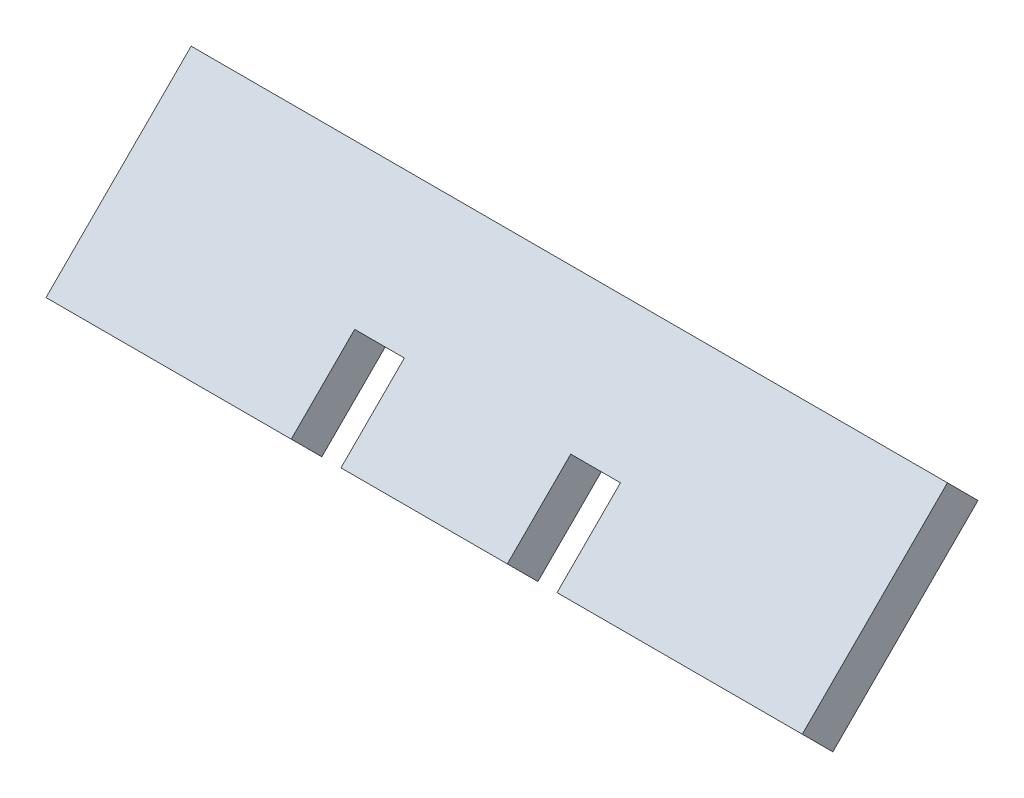
ISO-10303-21;
HEADER;
FILE_DESCRIPTION(('STEP AP214'),'2;1');
FILE_NAME('part.step','',(''),(''),'','','');
FILE_SCHEMA(('AUTOMOTIVE_DESIGN { 1 0 10303 214 1 1 1 1 }'));
ENDSEC;
DATA;
#1=APPLICATION_CONTEXT('core data for automotive mechanical design processes');
#2=APPLICATION_PROTOCOL_DEFINITION('international standard','automotive_design',2000,#1);
#3=PRODUCT_CONTEXT('',#1,'mechanical');
#4=PRODUCT('Part','Part','',(#3));
#5=PRODUCT_RELATED_PRODUCT_CATEGORY('part','',(#4));
#6=PRODUCT_DEFINITION_FORMATION('','',#4);
#7=PRODUCT_DEFINITION_CONTEXT('part definition',#1,'design');
#8=PRODUCT_DEFINITION('design','',#6,#7);
#9=PRODUCT_DEFINITION_SHAPE('','',#8);
#10=(LENGTH_UNIT() NAMED_UNIT(*) SI_UNIT(.MILLI.,.METRE.));
#11=(NAMED_UNIT(*) PLANE_ANGLE_UNIT() SI_UNIT($,.RADIAN.));
#12=(NAMED_UNIT(*) SI_UNIT($,.STERADIAN.) SOLID_ANGLE_UNIT());
#13=UNCERTAINTY_MEASURE_WITH_UNIT(LENGTH_MEASURE(1.E-05),#10,'distance_accuracy_value','');
#14=(GEOMETRIC_REPRESENTATION_CONTEXT(3) GLOBAL_UNCERTAINTY_ASSIGNED_CONTEXT((#13)) GLOBAL_UNIT_ASSIGNED_CONTEXT((#10,
#11,#12)) REPRESENTATION_CONTEXT('',''));
#15=CARTESIAN_POINT('',(0.,0.,0.));
#16=DIRECTION('',(0.,0.,1.));
#17=DIRECTION('',(1.,0.,0.));
#18=AXIS2_PLACEMENT_3D('',#15,#16,#17);
#19=CARTESIAN_POINT('',(-349.7,88.3951018154562,54.8947169102428));
#20=DIRECTION('',(0.,-0.707106781186548,-0.707106781186547));
#21=DIRECTION('',(0.,0.707106781186547,-0.707106781186548));
#22=AXIS2_PLACEMENT_3D('',#19,#20,#21);
#23=PLANE('',#22);
#24=DIRECTION('',(1.,0.,0.));
#25=VECTOR('',#24,1.);
#26=CARTESIAN_POINT('',(-349.7,88.3951018154562,54.8947169102428));
#27=LINE('',#26,#25);
#28=CARTESIAN_POINT('',(-329.7,88.3951018154562,54.8947169102428));
#29=VERTEX_POINT('',#28);
#30=CARTESIAN_POINT('',(-259.7,88.3951018154562,54.8947169102428));
#31=VERTEX_POINT('',#30);
#32=EDGE_CURVE('E165',#29,#31,#27,.T.);
#33=ORIENTED_EDGE('',*,*,#32,.T.);
#34=DIRECTION('',(0.,-0.707106781186547,0.707106781186548));
#35=VECTOR('',#34,1.);
#36=CARTESIAN_POINT('',(-259.7,88.3951018154562,54.8947169102428));
#37=LINE('',#36,#35);
#38=CARTESIAN_POINT('',(-259.7,74.9600729729119,68.3297457527872));
#39=VERTEX_POINT('',#38);
#40=EDGE_CURVE('E61',#31,#39,#37,.T.);
#41=ORIENTED_EDGE('',*,*,#40,.T.);
#42=DIRECTION('',(1.,0.,0.));
#43=VECTOR('',#42,1.);
#44=CARTESIAN_POINT('',(-349.7,74.9600729729119,68.3297457527872));
#45=LINE('',#44,#43);
#46=CARTESIAN_POINT('',(-282.4,74.9600729729119,68.3297457527872));
#47=VERTEX_POINT('',#46);
#48=EDGE_CURVE('E222',#47,#39,#45,.T.);
#49=ORIENTED_EDGE('',*,*,#48,.F.);
#50=DIRECTION('',(0.,0.707106781186546,-0.707106781186549));
#51=VECTOR('',#50,1.);
#52=CARTESIAN_POINT('',(-282.4,66.0267655037632,77.2630532219361));
#53=LINE('',#52,#51);
#54=CARTESIAN_POINT('',(-282.4,80.8290592567604,62.4607594689388));
#55=VERTEX_POINT('',#54);
#56=EDGE_CURVE('E174',#47,#55,#53,.T.);
#57=ORIENTED_EDGE('',*,*,#56,.T.);
#58=DIRECTION('',(1.,0.,0.));
#59=VECTOR('',#58,1.);
#60=CARTESIAN_POINT('',(-282.55,80.8290592567604,62.4607594689388));
#61=LINE('',#60,#59);
#62=CARTESIAN_POINT('',(-287.,80.8290592567604,62.4607594689388));
#63=VERTEX_POINT('',#62);
#64=EDGE_CURVE('E180',#55,#63,#61,.F.);
#65=ORIENTED_EDGE('',*,*,#64,.T.);
#66=DIRECTION('',(0.,0.707106781186546,-0.707106781186549));
#67=VECTOR('',#66,1.);
#68=CARTESIAN_POINT('',(-287.,80.7229932395824,62.5668254861168));
#69=LINE('',#68,#67);
#70=CARTESIAN_POINT('',(-287.,74.9600729729119,68.3297457527873));
#71=VERTEX_POINT('',#70);
#72=EDGE_CURVE('E175',#63,#71,#69,.F.);
#73=ORIENTED_EDGE('',*,*,#72,.T.);
#74=CARTESIAN_POINT('',(-302.4,74.9600729729119,68.3297457527873));
#75=VERTEX_POINT('',#74);
#76=EDGE_CURVE('E184',#75,#71,#45,.T.);
#77=ORIENTED_EDGE('',*,*,#76,.F.);
#78=DIRECTION('',(0.,0.707106781186546,-0.707106781186549));
#79=VECTOR('',#78,1.);
#80=CARTESIAN_POINT('',(-302.4,80.7229932395824,62.5668254861168));
#81=LINE('',#80,#79);
#82=CARTESIAN_POINT('',(-302.4,80.8290592567604,62.4607594689388));
#83=VERTEX_POINT('',#82);
#84=EDGE_CURVE('E252',#83,#75,#81,.F.);
#85=ORIENTED_EDGE('',*,*,#84,.F.);
#86=DIRECTION('',(1.,0.,0.));
#87=VECTOR('',#86,1.);
#88=CARTESIAN_POINT('',(-306.85,80.8290592567604,62.4607594689388));
#89=LINE('',#88,#87);
#90=CARTESIAN_POINT('',(-307.,80.8290592567604,62.4607594689388));
#91=VERTEX_POINT('',#90);
#92=EDGE_CURVE('E279',#91,#83,#89,.T.);
#93=ORIENTED_EDGE('',*,*,#92,.F.);
#94=DIRECTION('',(0.,0.707106781186546,-0.707106781186549));
#95=VECTOR('',#94,1.);
#96=CARTESIAN_POINT('',(-307.,66.0267655037632,77.2630532219361));
#97=LINE('',#96,#95);
#98=CARTESIAN_POINT('',(-307.,74.9600729729119,68.3297457527873));
#99=VERTEX_POINT('',#98);
#100=EDGE_CURVE('E271',#99,#91,#97,.T.);
#101=ORIENTED_EDGE('',*,*,#100,.F.);
#102=CARTESIAN_POINT('',(-329.7,74.9600729729119,68.3297457527872));
#103=VERTEX_POINT('',#102);
#104=EDGE_CURVE('E167',#103,#99,#45,.T.);
#105=ORIENTED_EDGE('',*,*,#104,.F.);
#106=DIRECTION('',(0.,0.707106781186547,-0.707106781186548));
#107=VECTOR('',#106,1.);
#108=CARTESIAN_POINT('',(-329.7,88.3951018154562,54.8947169102428));
#109=LINE('',#108,#107);
#110=EDGE_CURVE('E154',#103,#29,#109,.T.);
#111=ORIENTED_EDGE('',*,*,#110,.T.);
#112=EDGE_LOOP('',(#33,#41,#49,#57,#65,#73,#77,#85,#93,#101,#105,#111));
#113=FACE_BOUND('',#112,.T.);
#114=ADVANCED_FACE('F42',(#113),#23,.T.);
#115=CARTESIAN_POINT('',(-349.7,77.7885000976581,71.1581728775334));
#116=DIRECTION('',(0.,-0.707106781186546,0.707106781186549));
#117=DIRECTION('',(0.,-0.707106781186549,-0.707106781186546));
#118=AXIS2_PLACEMENT_3D('',#115,#116,#117);
#119=PLANE('',#118);
#120=DIRECTION('',(1.,0.,0.));
#121=VECTOR('',#120,1.);
#122=CARTESIAN_POINT('',(-349.7,77.7885000976581,71.1581728775334));
#123=LINE('',#122,#121);
#124=CARTESIAN_POINT('',(-329.7,77.7885000976581,71.1581728775334));
#125=VERTEX_POINT('',#124);
#126=CARTESIAN_POINT('',(-307.,77.7885000976581,71.1581728775335));
#127=VERTEX_POINT('',#126);
#128=EDGE_CURVE('E194',#125,#127,#123,.T.);
#129=ORIENTED_EDGE('',*,*,#128,.F.);
#130=DIRECTION('',(0.,-0.707106781186549,-0.707106781186546));
#131=VECTOR('',#130,1.);
#132=CARTESIAN_POINT('',(-329.7,77.7885000976581,71.1581728775334));
#133=LINE('',#132,#131);
#134=EDGE_CURVE('E170',#125,#103,#133,.T.);
#135=ORIENTED_EDGE('',*,*,#134,.T.);
#136=ORIENTED_EDGE('',*,*,#104,.T.);
#137=DIRECTION('',(0.,0.707106781186549,0.707106781186546));
#138=VECTOR('',#137,1.);
#139=CARTESIAN_POINT('',(-307.,77.7885000976581,71.1581728775334));
#140=LINE('',#139,#138);
#141=EDGE_CURVE('E221',#99,#127,#140,.T.);
#142=ORIENTED_EDGE('',*,*,#141,.T.);
#143=EDGE_LOOP('',(#129,#135,#136,#142));
#144=FACE_BOUND('',#143,.T.);
#145=ADVANCED_FACE('F296',(#144),#119,.T.);
#146=CARTESIAN_POINT('',(-349.7,91.2235289402024,57.7231440349889));
#147=DIRECTION('',(0.,0.707106781186552,0.707106781186543));
#148=DIRECTION('',(0.,-0.707106781186543,0.707106781186552));
#149=AXIS2_PLACEMENT_3D('',#146,#147,#148);
#150=PLANE('',#149);
#151=CARTESIAN_POINT('',(-282.4,77.7885000976581,71.1581728775335));
#152=VERTEX_POINT('',#151);
#153=CARTESIAN_POINT('',(-259.7,77.7885000976581,71.1581728775334));
#154=VERTEX_POINT('',#153);
#155=EDGE_CURVE('E228',#152,#154,#123,.T.);
#156=ORIENTED_EDGE('',*,*,#155,.T.);
#157=DIRECTION('',(0.,0.707106781186543,-0.707106781186552));
#158=VECTOR('',#157,1.);
#159=CARTESIAN_POINT('',(-259.7,91.2235289402024,57.7231440349889));
#160=LINE('',#159,#158);
#161=CARTESIAN_POINT('',(-259.7,91.2235289402024,57.7231440349889));
#162=VERTEX_POINT('',#161);
#163=EDGE_CURVE('E169',#154,#162,#160,.T.);
#164=ORIENTED_EDGE('',*,*,#163,.T.);
#165=DIRECTION('',(1.,0.,0.));
#166=VECTOR('',#165,1.);
#167=CARTESIAN_POINT('',(-349.7,91.2235289402024,57.7231440349889));
#168=LINE('',#167,#166);
#169=CARTESIAN_POINT('',(-329.7,91.2235289402024,57.7231440349889));
#170=VERTEX_POINT('',#169);
#171=EDGE_CURVE('E232',#170,#162,#168,.T.);
#172=ORIENTED_EDGE('',*,*,#171,.F.);
#173=DIRECTION('',(0.,-0.707106781186543,0.707106781186552));
#174=VECTOR('',#173,1.);
#175=CARTESIAN_POINT('',(-329.7,91.2235289402024,57.7231440349889));
#176=LINE('',#175,#174);
#177=EDGE_CURVE('E70',#170,#125,#176,.T.);
#178=ORIENTED_EDGE('',*,*,#177,.T.);
#179=ORIENTED_EDGE('',*,*,#128,.T.);
#180=DIRECTION('',(0.,0.707106781186543,-0.707106781186552));
#181=VECTOR('',#180,1.);
#182=CARTESIAN_POINT('',(-307.,91.2235289402024,57.7231440349889));
#183=LINE('',#182,#181);
#184=CARTESIAN_POINT('',(-307.,83.6574863815066,65.289186593685));
#185=VERTEX_POINT('',#184);
#186=EDGE_CURVE('E189',#127,#185,#183,.T.);
#187=ORIENTED_EDGE('',*,*,#186,.T.);
#188=DIRECTION('',(1.,0.,0.));
#189=VECTOR('',#188,1.);
#190=CARTESIAN_POINT('',(-306.85,83.6574863815066,65.289186593685));
#191=LINE('',#190,#189);
#192=CARTESIAN_POINT('',(-302.4,83.6574863815066,65.289186593685));
#193=VERTEX_POINT('',#192);
#194=EDGE_CURVE('E193',#185,#193,#191,.T.);
#195=ORIENTED_EDGE('',*,*,#194,.T.);
#196=DIRECTION('',(0.,0.707106781186546,-0.707106781186549));
#197=VECTOR('',#196,1.);
#198=CARTESIAN_POINT('',(-302.4,83.5514203643286,65.395252610863));
#199=LINE('',#198,#197);
#200=CARTESIAN_POINT('',(-302.4,77.7885000976581,71.1581728775334));
#201=VERTEX_POINT('',#200);
#202=EDGE_CURVE('E262',#193,#201,#199,.F.);
#203=ORIENTED_EDGE('',*,*,#202,.T.);
#204=CARTESIAN_POINT('',(-287.,77.7885000976581,71.1581728775335));
#205=VERTEX_POINT('',#204);
#206=EDGE_CURVE('E233',#201,#205,#123,.T.);
#207=ORIENTED_EDGE('',*,*,#206,.T.);
#208=DIRECTION('',(0.,0.707106781186546,-0.707106781186549));
#209=VECTOR('',#208,1.);
#210=CARTESIAN_POINT('',(-287.,83.5514203643286,65.395252610863));
#211=LINE('',#210,#209);
#212=CARTESIAN_POINT('',(-287.,83.6574863815066,65.289186593685));
#213=VERTEX_POINT('',#212);
#214=EDGE_CURVE('E208',#213,#205,#211,.F.);
#215=ORIENTED_EDGE('',*,*,#214,.F.);
#216=DIRECTION('',(1.,0.,0.));
#217=VECTOR('',#216,1.);
#218=CARTESIAN_POINT('',(-282.55,83.6574863815066,65.289186593685));
#219=LINE('',#218,#217);
#220=CARTESIAN_POINT('',(-282.4,83.6574863815066,65.289186593685));
#221=VERTEX_POINT('',#220);
#222=EDGE_CURVE('E205',#221,#213,#219,.F.);
#223=ORIENTED_EDGE('',*,*,#222,.F.);
#224=DIRECTION('',(0.,0.707106781186546,-0.707106781186549));
#225=VECTOR('',#224,1.);
#226=CARTESIAN_POINT('',(-282.4,68.8551926285094,80.0914803466823));
#227=LINE('',#226,#225);
#228=EDGE_CURVE('E161',#152,#221,#227,.T.);
#229=ORIENTED_EDGE('',*,*,#228,.F.);
#230=EDGE_LOOP('',(#156,#164,#172,#178,#179,#187,#195,#203,#207,#215,#223,#229));
#231=FACE_BOUND('',#230,.T.);
#232=ADVANCED_FACE('F295',(#231),#150,.T.);
#233=ORIENTED_EDGE('',*,*,#48,.T.);
#234=DIRECTION('',(0.,0.707106781186549,0.707106781186546));
#235=VECTOR('',#234,1.);
#236=CARTESIAN_POINT('',(-259.7,77.7885000976581,71.1581728775334));
#237=LINE('',#236,#235);
#238=EDGE_CURVE('E241',#39,#154,#237,.T.);
#239=ORIENTED_EDGE('',*,*,#238,.T.);
#240=ORIENTED_EDGE('',*,*,#155,.F.);
#241=DIRECTION('',(0.,0.707106781186549,0.707106781186546));
#242=VECTOR('',#241,1.);
#243=CARTESIAN_POINT('',(-282.4,77.7885000976581,71.1581728775334));
#244=LINE('',#243,#242);
#245=EDGE_CURVE('E204',#47,#152,#244,.T.);
#246=ORIENTED_EDGE('',*,*,#245,.F.);
#247=EDGE_LOOP('',(#233,#239,#240,#246));
#248=FACE_BOUND('',#247,.T.);
#249=ADVANCED_FACE('F318',(#248),#119,.T.);
#250=CARTESIAN_POINT('',(-349.7,91.2235289402024,57.7231440349889));
#251=DIRECTION('',(0.,0.707106781186545,-0.70710678118655));
#252=DIRECTION('',(0.,0.70710678118655,0.707106781186545));
#253=AXIS2_PLACEMENT_3D('',#250,#251,#252);
#254=PLANE('',#253);
#255=ORIENTED_EDGE('',*,*,#171,.T.);
#256=DIRECTION('',(0.,-0.70710678118655,-0.707106781186545));
#257=VECTOR('',#256,1.);
#258=CARTESIAN_POINT('',(-259.7,91.2235289402024,57.7231440349889));
#259=LINE('',#258,#257);
#260=EDGE_CURVE('E11',#162,#31,#259,.T.);
#261=ORIENTED_EDGE('',*,*,#260,.T.);
#262=ORIENTED_EDGE('',*,*,#32,.F.);
#263=DIRECTION('',(0.,0.70710678118655,0.707106781186545));
#264=VECTOR('',#263,1.);
#265=CARTESIAN_POINT('',(-329.7,91.2235289402024,57.7231440349889));
#266=LINE('',#265,#264);
#267=EDGE_CURVE('E51',#29,#170,#266,.T.);
#268=ORIENTED_EDGE('',*,*,#267,.T.);
#269=EDGE_LOOP('',(#255,#261,#262,#268));
#270=FACE_BOUND('',#269,.T.);
#271=ADVANCED_FACE('F172',(#270),#254,.T.);
#272=DIRECTION('',(0.,-0.707106781186549,-0.707106781186546));
#273=VECTOR('',#272,1.);
#274=CARTESIAN_POINT('',(-287.,77.7885000976581,71.1581728775334));
#275=LINE('',#274,#273);
#276=EDGE_CURVE('E195',#205,#71,#275,.T.);
#277=ORIENTED_EDGE('',*,*,#276,.F.);
#278=ORIENTED_EDGE('',*,*,#206,.F.);
#279=DIRECTION('',(0.,-0.707106781186549,-0.707106781186546));
#280=VECTOR('',#279,1.);
#281=CARTESIAN_POINT('',(-302.4,77.7885000976581,71.1581728775334));
#282=LINE('',#281,#280);
#283=EDGE_CURVE('E235',#201,#75,#282,.T.);
#284=ORIENTED_EDGE('',*,*,#283,.T.);
#285=ORIENTED_EDGE('',*,*,#76,.T.);
#286=EDGE_LOOP('',(#277,#278,#284,#285));
#287=FACE_BOUND('',#286,.T.);
#288=ADVANCED_FACE('F310',(#287),#119,.T.);
#289=CARTESIAN_POINT('',(-302.4,80.7229932395824,62.5668254861168));
#290=DIRECTION('',(-1.,0.,0.));
#291=DIRECTION('',(0.,0.,1.));
#292=AXIS2_PLACEMENT_3D('',#289,#290,#291);
#293=PLANE('',#292);
#294=ORIENTED_EDGE('',*,*,#202,.F.);
#295=DIRECTION('',(0.,0.707106781186549,0.707106781186546));
#296=VECTOR('',#295,1.);
#297=CARTESIAN_POINT('',(-302.4,80.8290592567604,62.4607594689388));
#298=LINE('',#297,#296);
#299=EDGE_CURVE('E248',#83,#193,#298,.T.);
#300=ORIENTED_EDGE('',*,*,#299,.F.);
#301=ORIENTED_EDGE('',*,*,#84,.T.);
#302=ORIENTED_EDGE('',*,*,#283,.F.);
#303=EDGE_LOOP('',(#294,#300,#301,#302));
#304=FACE_BOUND('',#303,.T.);
#305=ADVANCED_FACE('F300',(#304),#293,.T.);
#306=CARTESIAN_POINT('',(-306.85,80.8290592567604,62.4607594689388));
#307=DIRECTION('',(0.,-0.707106781186546,0.707106781186549));
#308=DIRECTION('',(0.,-0.707106781186549,-0.707106781186546));
#309=AXIS2_PLACEMENT_3D('',#306,#307,#308);
#310=PLANE('',#309);
#311=ORIENTED_EDGE('',*,*,#194,.F.);
#312=DIRECTION('',(0.,0.707106781186549,0.707106781186546));
#313=VECTOR('',#312,1.);
#314=CARTESIAN_POINT('',(-307.,80.8290592567604,62.4607594689388));
#315=LINE('',#314,#313);
#316=EDGE_CURVE('E199',#91,#185,#315,.T.);
#317=ORIENTED_EDGE('',*,*,#316,.F.);
#318=ORIENTED_EDGE('',*,*,#92,.T.);
#319=ORIENTED_EDGE('',*,*,#299,.T.);
#320=EDGE_LOOP('',(#311,#317,#318,#319));
#321=FACE_BOUND('',#320,.T.);
#322=ADVANCED_FACE('F301',(#321),#310,.T.);
#323=CARTESIAN_POINT('',(-307.,66.0267655037632,77.2630532219361));
#324=DIRECTION('',(1.,0.,0.));
#325=DIRECTION('',(0.,0.,-1.));
#326=AXIS2_PLACEMENT_3D('',#323,#324,#325);
#327=PLANE('',#326);
#328=ORIENTED_EDGE('',*,*,#100,.T.);
#329=ORIENTED_EDGE('',*,*,#316,.T.);
#330=ORIENTED_EDGE('',*,*,#186,.F.);
#331=ORIENTED_EDGE('',*,*,#141,.F.);
#332=EDGE_LOOP('',(#328,#329,#330,#331));
#333=FACE_BOUND('',#332,.T.);
#334=ADVANCED_FACE('F297',(#333),#327,.T.);
#335=CARTESIAN_POINT('',(-287.,80.7229932395824,62.5668254861168));
#336=DIRECTION('',(-1.,0.,0.));
#337=DIRECTION('',(0.,0.,1.));
#338=AXIS2_PLACEMENT_3D('',#335,#336,#337);
#339=PLANE('',#338);
#340=ORIENTED_EDGE('',*,*,#276,.T.);
#341=ORIENTED_EDGE('',*,*,#72,.F.);
#342=DIRECTION('',(0.,0.707106781186549,0.707106781186546));
#343=VECTOR('',#342,1.);
#344=CARTESIAN_POINT('',(-287.,80.8290592567604,62.4607594689388));
#345=LINE('',#344,#343);
#346=EDGE_CURVE('E198',#63,#213,#345,.T.);
#347=ORIENTED_EDGE('',*,*,#346,.T.);
#348=ORIENTED_EDGE('',*,*,#214,.T.);
#349=EDGE_LOOP('',(#340,#341,#347,#348));
#350=FACE_BOUND('',#349,.T.);
#351=ADVANCED_FACE('F308',(#350),#339,.F.);
#352=CARTESIAN_POINT('',(-282.55,80.8290592567604,62.4607594689388));
#353=DIRECTION('',(0.,0.707106781186546,-0.707106781186549));
#354=DIRECTION('',(0.,0.707106781186549,0.707106781186546));
#355=AXIS2_PLACEMENT_3D('',#352,#353,#354);
#356=PLANE('',#355);
#357=ORIENTED_EDGE('',*,*,#222,.T.);
#358=ORIENTED_EDGE('',*,*,#346,.F.);
#359=ORIENTED_EDGE('',*,*,#64,.F.);
#360=DIRECTION('',(0.,0.707106781186549,0.707106781186546));
#361=VECTOR('',#360,1.);
#362=CARTESIAN_POINT('',(-282.4,80.8290592567604,62.4607594689388));
#363=LINE('',#362,#361);
#364=EDGE_CURVE('E200',#55,#221,#363,.T.);
#365=ORIENTED_EDGE('',*,*,#364,.T.);
#366=EDGE_LOOP('',(#357,#358,#359,#365));
#367=FACE_BOUND('',#366,.T.);
#368=ADVANCED_FACE('F44',(#367),#356,.F.);
#369=CARTESIAN_POINT('',(-282.4,66.0267655037632,77.2630532219361));
#370=DIRECTION('',(1.,0.,0.));
#371=DIRECTION('',(0.,0.,-1.));
#372=AXIS2_PLACEMENT_3D('',#369,#370,#371);
#373=PLANE('',#372);
#374=ORIENTED_EDGE('',*,*,#245,.T.);
#375=ORIENTED_EDGE('',*,*,#228,.T.);
#376=ORIENTED_EDGE('',*,*,#364,.F.);
#377=ORIENTED_EDGE('',*,*,#56,.F.);
#378=EDGE_LOOP('',(#374,#375,#376,#377));
#379=FACE_BOUND('',#378,.T.);
#380=ADVANCED_FACE('F323',(#379),#373,.F.);
#381=CARTESIAN_POINT('',(-329.7,-314.412431225121,347.268469937616));
#382=DIRECTION('',(-1.,0.,0.));
#383=DIRECTION('',(0.,0.,1.));
#384=AXIS2_PLACEMENT_3D('',#381,#382,#383);
#385=PLANE('',#384);
#386=ORIENTED_EDGE('',*,*,#134,.F.);
#387=ORIENTED_EDGE('',*,*,#177,.F.);
#388=ORIENTED_EDGE('',*,*,#267,.F.);
#389=ORIENTED_EDGE('',*,*,#110,.F.);
#390=EDGE_LOOP('',(#386,#387,#388,#389));
#391=FACE_BOUND('',#390,.T.);
#392=ADVANCED_FACE('F153',(#391),#385,.T.);
#393=CARTESIAN_POINT('',(-259.7,-281.71116302881,389.802799785479));
#394=DIRECTION('',(1.,0.,0.));
#395=DIRECTION('',(0.,0.,-1.));
#396=AXIS2_PLACEMENT_3D('',#393,#394,#395);
#397=PLANE('',#396);
#398=ORIENTED_EDGE('',*,*,#40,.F.);
#399=ORIENTED_EDGE('',*,*,#260,.F.);
#400=ORIENTED_EDGE('',*,*,#163,.F.);
#401=ORIENTED_EDGE('',*,*,#238,.F.);
#402=EDGE_LOOP('',(#398,#399,#400,#401));
#403=FACE_BOUND('',#402,.T.);
#404=ADVANCED_FACE('F330',(#403),#397,.T.);
#405=CLOSED_SHELL('',(#114,#145,#232,#249,#271,#288,#305,#322,#334,#351,#368,#380,#392,#404));
#406=MANIFOLD_SOLID_BREP('B2',#405);
#407=ADVANCED_BREP_SHAPE_REPRESENTATION('',(#18,#406),#14);
#408=SHAPE_DEFINITION_REPRESENTATION(#9,#407);
ENDSEC;
END-ISO-10303-21;
